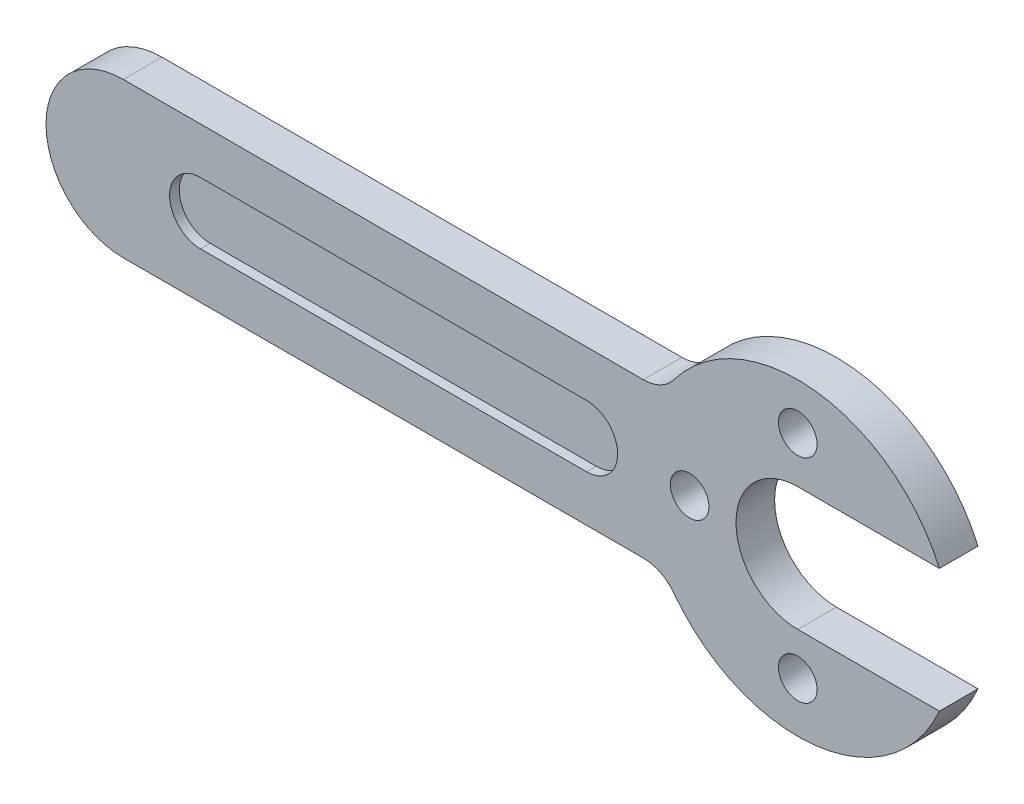
ISO-10303-21;
HEADER;
FILE_DESCRIPTION(('STEP AP214'),'2;1');
FILE_NAME('part.step','',(''),(''),'','','');
FILE_SCHEMA(('AUTOMOTIVE_DESIGN { 1 0 10303 214 1 1 1 1 }'));
ENDSEC;
DATA;
#1=APPLICATION_CONTEXT('core data for automotive mechanical design processes');
#2=APPLICATION_PROTOCOL_DEFINITION('international standard','automotive_design',2000,#1);
#3=PRODUCT_CONTEXT('',#1,'mechanical');
#4=PRODUCT('Part','Part','',(#3));
#5=PRODUCT_RELATED_PRODUCT_CATEGORY('part','',(#4));
#6=PRODUCT_DEFINITION_FORMATION('','',#4);
#7=PRODUCT_DEFINITION_CONTEXT('part definition',#1,'design');
#8=PRODUCT_DEFINITION('design','',#6,#7);
#9=PRODUCT_DEFINITION_SHAPE('','',#8);
#10=(LENGTH_UNIT() NAMED_UNIT(*) SI_UNIT(.MILLI.,.METRE.));
#11=(NAMED_UNIT(*) PLANE_ANGLE_UNIT() SI_UNIT($,.RADIAN.));
#12=(NAMED_UNIT(*) SI_UNIT($,.STERADIAN.) SOLID_ANGLE_UNIT());
#13=UNCERTAINTY_MEASURE_WITH_UNIT(LENGTH_MEASURE(1.E-05),#10,'distance_accuracy_value','');
#14=(GEOMETRIC_REPRESENTATION_CONTEXT(3) GLOBAL_UNCERTAINTY_ASSIGNED_CONTEXT((#13)) GLOBAL_UNIT_ASSIGNED_CONTEXT((#10,
#11,#12)) REPRESENTATION_CONTEXT('',''));
#15=CARTESIAN_POINT('',(0.,0.,0.));
#16=DIRECTION('',(0.,0.,1.));
#17=DIRECTION('',(1.,0.,0.));
#18=AXIS2_PLACEMENT_3D('',#15,#16,#17);
#19=CARTESIAN_POINT('',(-154.641016151378,0.,5.));
#20=DIRECTION('',(0.,0.,-1.));
#21=DIRECTION('',(-1.,0.,0.));
#22=AXIS2_PLACEMENT_3D('',#19,#20,#21);
#23=CYLINDRICAL_SURFACE('',#22,8.);
#24=DIRECTION('',(0.,0.,-1.));
#25=VECTOR('',#24,1.);
#26=CARTESIAN_POINT('',(-154.641016151378,7.99999999999999,5.));
#27=LINE('',#26,#25);
#28=CARTESIAN_POINT('',(-154.641016151378,7.99999999999999,-2.5));
#29=VERTEX_POINT('',#28);
#30=CARTESIAN_POINT('',(-154.641016151378,7.99999999999999,-5.));
#31=VERTEX_POINT('',#30);
#32=EDGE_CURVE('E184',#29,#31,#27,.T.);
#33=ORIENTED_EDGE('',*,*,#32,.F.);
#34=CARTESIAN_POINT('',(-154.641016151378,0.,-2.5));
#35=DIRECTION('',(0.,0.,1.));
#36=DIRECTION('',(1.,0.,0.));
#37=AXIS2_PLACEMENT_3D('',#34,#35,#36);
#38=CIRCLE('',#37,8.);
#39=CARTESIAN_POINT('',(-154.641016151378,-8.00000000000001,-2.5));
#40=VERTEX_POINT('',#39);
#41=EDGE_CURVE('E212',#29,#40,#38,.T.);
#42=ORIENTED_EDGE('',*,*,#41,.T.);
#43=DIRECTION('',(0.,0.,-1.));
#44=VECTOR('',#43,1.);
#45=CARTESIAN_POINT('',(-154.641016151378,-8.00000000000001,5.));
#46=LINE('',#45,#44);
#47=CARTESIAN_POINT('',(-154.641016151378,-8.00000000000001,-5.));
#48=VERTEX_POINT('',#47);
#49=EDGE_CURVE('E250',#40,#48,#46,.T.);
#50=ORIENTED_EDGE('',*,*,#49,.T.);
#51=CARTESIAN_POINT('',(-154.641016151378,0.,-5.));
#52=DIRECTION('',(0.,0.,1.));
#53=DIRECTION('',(1.,0.,0.));
#54=AXIS2_PLACEMENT_3D('',#51,#52,#53);
#55=CIRCLE('',#54,8.);
#56=EDGE_CURVE('E192',#31,#48,#55,.T.);
#57=ORIENTED_EDGE('',*,*,#56,.F.);
#58=EDGE_LOOP('',(#33,#42,#50,#57));
#59=FACE_BOUND('',#58,.T.);
#60=ADVANCED_FACE('F45',(#59),#23,.F.);
#61=CARTESIAN_POINT('',(-154.641016151378,-8.00000000000001,5.));
#62=DIRECTION('',(0.,1.,0.));
#63=DIRECTION('',(-1.,0.,0.));
#64=AXIS2_PLACEMENT_3D('',#61,#62,#63);
#65=PLANE('',#64);
#66=ORIENTED_EDGE('',*,*,#49,.F.);
#67=DIRECTION('',(1.,0.,0.));
#68=VECTOR('',#67,1.);
#69=CARTESIAN_POINT('',(0.,-7.99999999999995,-2.5));
#70=LINE('',#69,#68);
#71=CARTESIAN_POINT('',(-54.6410161513776,-7.99999999999997,-2.5));
#72=VERTEX_POINT('',#71);
#73=EDGE_CURVE('E201',#40,#72,#70,.T.);
#74=ORIENTED_EDGE('',*,*,#73,.T.);
#75=DIRECTION('',(0.,0.,-1.));
#76=VECTOR('',#75,1.);
#77=CARTESIAN_POINT('',(-54.6410161513776,-7.99999999999997,5.));
#78=LINE('',#77,#76);
#79=CARTESIAN_POINT('',(-54.6410161513776,-7.99999999999997,-5.));
#80=VERTEX_POINT('',#79);
#81=EDGE_CURVE('E246',#72,#80,#78,.T.);
#82=ORIENTED_EDGE('',*,*,#81,.T.);
#83=DIRECTION('',(1.,0.,0.));
#84=VECTOR('',#83,1.);
#85=CARTESIAN_POINT('',(-154.641016151378,-8.00000000000001,-5.));
#86=LINE('',#85,#84);
#87=EDGE_CURVE('E232',#48,#80,#86,.T.);
#88=ORIENTED_EDGE('',*,*,#87,.F.);
#89=EDGE_LOOP('',(#66,#74,#82,#88));
#90=FACE_BOUND('',#89,.T.);
#91=ADVANCED_FACE('F434',(#90),#65,.T.);
#92=CARTESIAN_POINT('',(-54.6410161513776,0.,5.));
#93=DIRECTION('',(0.,0.,-1.));
#94=DIRECTION('',(-1.,0.,0.));
#95=AXIS2_PLACEMENT_3D('',#92,#93,#94);
#96=CYLINDRICAL_SURFACE('',#95,8.);
#97=ORIENTED_EDGE('',*,*,#81,.F.);
#98=CARTESIAN_POINT('',(-54.6410161513776,0.,-2.5));
#99=DIRECTION('',(0.,0.,1.));
#100=DIRECTION('',(1.,0.,0.));
#101=AXIS2_PLACEMENT_3D('',#98,#99,#100);
#102=CIRCLE('',#101,8.);
#103=CARTESIAN_POINT('',(-54.6410161513776,8.00000000000003,-2.5));
#104=VERTEX_POINT('',#103);
#105=EDGE_CURVE('E205',#72,#104,#102,.T.);
#106=ORIENTED_EDGE('',*,*,#105,.T.);
#107=DIRECTION('',(0.,0.,-1.));
#108=VECTOR('',#107,1.);
#109=CARTESIAN_POINT('',(-54.6410161513776,8.00000000000003,5.));
#110=LINE('',#109,#108);
#111=CARTESIAN_POINT('',(-54.6410161513776,8.00000000000003,-5.));
#112=VERTEX_POINT('',#111);
#113=EDGE_CURVE('E183',#104,#112,#110,.T.);
#114=ORIENTED_EDGE('',*,*,#113,.T.);
#115=CARTESIAN_POINT('',(-54.6410161513776,0.,-5.));
#116=DIRECTION('',(0.,0.,1.));
#117=DIRECTION('',(1.,0.,0.));
#118=AXIS2_PLACEMENT_3D('',#115,#116,#117);
#119=CIRCLE('',#118,8.);
#120=EDGE_CURVE('E236',#80,#112,#119,.T.);
#121=ORIENTED_EDGE('',*,*,#120,.F.);
#122=EDGE_LOOP('',(#97,#106,#114,#121));
#123=FACE_BOUND('',#122,.T.);
#124=ADVANCED_FACE('F440',(#123),#96,.F.);
#125=CARTESIAN_POINT('',(-154.641016151378,7.99999999999999,5.));
#126=DIRECTION('',(0.,-1.,0.));
#127=DIRECTION('',(1.,0.,0.));
#128=AXIS2_PLACEMENT_3D('',#125,#126,#127);
#129=PLANE('',#128);
#130=ORIENTED_EDGE('',*,*,#113,.F.);
#131=DIRECTION('',(1.,0.,0.));
#132=VECTOR('',#131,1.);
#133=CARTESIAN_POINT('',(0.,8.00000000000006,-2.5));
#134=LINE('',#133,#132);
#135=EDGE_CURVE('E209',#29,#104,#134,.T.);
#136=ORIENTED_EDGE('',*,*,#135,.F.);
#137=ORIENTED_EDGE('',*,*,#32,.T.);
#138=DIRECTION('',(-1.,0.,0.));
#139=VECTOR('',#138,1.);
#140=CARTESIAN_POINT('',(-154.641016151378,7.99999999999999,-5.));
#141=LINE('',#140,#139);
#142=EDGE_CURVE('E220',#112,#31,#141,.T.);
#143=ORIENTED_EDGE('',*,*,#142,.F.);
#144=EDGE_LOOP('',(#130,#136,#137,#143));
#145=FACE_BOUND('',#144,.T.);
#146=ADVANCED_FACE('F468',(#145),#129,.T.);
#147=CARTESIAN_POINT('',(0.,0.,5.));
#148=DIRECTION('',(0.,0.,1.));
#149=DIRECTION('',(1.,0.,0.));
#150=AXIS2_PLACEMENT_3D('',#147,#148,#149);
#151=PLANE('',#150);
#152=CARTESIAN_POINT('',(0.,-27.,5.));
#153=DIRECTION('',(0.,0.,1.));
#154=DIRECTION('',(1.,0.,0.));
#155=AXIS2_PLACEMENT_3D('',#152,#153,#154);
#156=CIRCLE('',#155,5.);
#157=CARTESIAN_POINT('',(5.00000000000001,-27.,5.));
#158=VERTEX_POINT('',#157);
#159=EDGE_CURVE('E262',#158,#158,#156,.T.);
#160=ORIENTED_EDGE('',*,*,#159,.F.);
#161=EDGE_LOOP('',(#160));
#162=FACE_BOUND('',#161,.T.);
#163=CARTESIAN_POINT('',(0.,0.,5.));
#164=DIRECTION('',(0.,0.,-1.));
#165=DIRECTION('',(1.,0.,0.));
#166=AXIS2_PLACEMENT_3D('',#163,#164,#165);
#167=CIRCLE('',#166,16.);
#168=CARTESIAN_POINT('',(0.,-16.,5.));
#169=VERTEX_POINT('',#168);
#170=CARTESIAN_POINT('',(0.,16.,5.));
#171=VERTEX_POINT('',#170);
#172=EDGE_CURVE('E278',#169,#171,#167,.T.);
#173=ORIENTED_EDGE('',*,*,#172,.T.);
#174=DIRECTION('',(1.,0.,0.));
#175=VECTOR('',#174,1.);
#176=CARTESIAN_POINT('',(0.,16.,5.));
#177=LINE('',#176,#175);
#178=CARTESIAN_POINT('',(36.6606055596467,16.,5.));
#179=VERTEX_POINT('',#178);
#180=EDGE_CURVE('E282',#171,#179,#177,.T.);
#181=ORIENTED_EDGE('',*,*,#180,.T.);
#182=CARTESIAN_POINT('',(0.,0.,5.));
#183=DIRECTION('',(0.,0.,1.));
#184=DIRECTION('',(1.,0.,0.));
#185=AXIS2_PLACEMENT_3D('',#182,#183,#184);
#186=CIRCLE('',#185,40.);
#187=CARTESIAN_POINT('',(-32.,24.,5.));
#188=VERTEX_POINT('',#187);
#189=EDGE_CURVE('E286',#179,#188,#186,.T.);
#190=ORIENTED_EDGE('',*,*,#189,.T.);
#191=CARTESIAN_POINT('',(-40.,30.,5.));
#192=DIRECTION('',(0.,0.,-1.));
#193=DIRECTION('',(1.,0.,0.));
#194=AXIS2_PLACEMENT_3D('',#191,#192,#193);
#195=CIRCLE('',#194,10.);
#196=CARTESIAN_POINT('',(-40.,20.,5.));
#197=VERTEX_POINT('',#196);
#198=EDGE_CURVE('E289',#188,#197,#195,.T.);
#199=ORIENTED_EDGE('',*,*,#198,.T.);
#200=DIRECTION('',(-1.,0.,0.));
#201=VECTOR('',#200,1.);
#202=CARTESIAN_POINT('',(-40.,20.,5.));
#203=LINE('',#202,#201);
#204=CARTESIAN_POINT('',(-174.641016151378,20.,5.));
#205=VERTEX_POINT('',#204);
#206=EDGE_CURVE('E292',#197,#205,#203,.T.);
#207=ORIENTED_EDGE('',*,*,#206,.T.);
#208=CARTESIAN_POINT('',(-174.641016151378,0.,5.));
#209=DIRECTION('',(0.,0.,1.));
#210=DIRECTION('',(1.,0.,0.));
#211=AXIS2_PLACEMENT_3D('',#208,#209,#210);
#212=CIRCLE('',#211,20.);
#213=CARTESIAN_POINT('',(-174.641016151378,-20.0000000000001,5.));
#214=VERTEX_POINT('',#213);
#215=EDGE_CURVE('E295',#205,#214,#212,.T.);
#216=ORIENTED_EDGE('',*,*,#215,.T.);
#217=DIRECTION('',(1.,0.,0.));
#218=VECTOR('',#217,1.);
#219=CARTESIAN_POINT('',(-174.641016151378,-20.,5.));
#220=LINE('',#219,#218);
#221=CARTESIAN_POINT('',(-40.,-20.,5.));
#222=VERTEX_POINT('',#221);
#223=EDGE_CURVE('E298',#214,#222,#220,.T.);
#224=ORIENTED_EDGE('',*,*,#223,.T.);
#225=CARTESIAN_POINT('',(-40.,-30.,5.));
#226=DIRECTION('',(0.,0.,-1.));
#227=DIRECTION('',(-1.,0.,0.));
#228=AXIS2_PLACEMENT_3D('',#225,#226,#227);
#229=CIRCLE('',#228,10.);
#230=CARTESIAN_POINT('',(-32.,-24.,5.));
#231=VERTEX_POINT('',#230);
#232=EDGE_CURVE('E301',#222,#231,#229,.T.);
#233=ORIENTED_EDGE('',*,*,#232,.T.);
#234=CARTESIAN_POINT('',(0.,0.,5.));
#235=DIRECTION('',(0.,0.,1.));
#236=DIRECTION('',(1.,0.,0.));
#237=AXIS2_PLACEMENT_3D('',#234,#235,#236);
#238=CIRCLE('',#237,40.);
#239=CARTESIAN_POINT('',(36.6606055596467,-16.,5.));
#240=VERTEX_POINT('',#239);
#241=EDGE_CURVE('E304',#231,#240,#238,.T.);
#242=ORIENTED_EDGE('',*,*,#241,.T.);
#243=DIRECTION('',(-1.,0.,0.));
#244=VECTOR('',#243,1.);
#245=CARTESIAN_POINT('',(0.,-16.,5.));
#246=LINE('',#245,#244);
#247=EDGE_CURVE('E307',#240,#169,#246,.T.);
#248=ORIENTED_EDGE('',*,*,#247,.T.);
#249=EDGE_LOOP('',(#173,#181,#190,#199,#207,#216,#224,#233,#242,#248));
#250=FACE_BOUND('',#249,.T.);
#251=CARTESIAN_POINT('',(0.,28.,5.));
#252=DIRECTION('',(0.,0.,1.));
#253=DIRECTION('',(1.,0.,0.));
#254=AXIS2_PLACEMENT_3D('',#251,#252,#253);
#255=CIRCLE('',#254,5.);
#256=CARTESIAN_POINT('',(5.00000000000001,28.,5.));
#257=VERTEX_POINT('',#256);
#258=EDGE_CURVE('E270',#257,#257,#255,.T.);
#259=ORIENTED_EDGE('',*,*,#258,.F.);
#260=EDGE_LOOP('',(#259));
#261=FACE_BOUND('',#260,.T.);
#262=CARTESIAN_POINT('',(-28.,0.,5.));
#263=DIRECTION('',(0.,0.,1.));
#264=DIRECTION('',(1.,0.,0.));
#265=AXIS2_PLACEMENT_3D('',#262,#263,#264);
#266=CIRCLE('',#265,5.);
#267=CARTESIAN_POINT('',(-23.,0.,5.));
#268=VERTEX_POINT('',#267);
#269=EDGE_CURVE('E254',#268,#268,#266,.T.);
#270=ORIENTED_EDGE('',*,*,#269,.F.);
#271=EDGE_LOOP('',(#270));
#272=FACE_BOUND('',#271,.T.);
#273=DIRECTION('',(1.,0.,0.));
#274=VECTOR('',#273,1.);
#275=CARTESIAN_POINT('',(-154.641016151378,-8.00000000000001,5.));
#276=LINE('',#275,#274);
#277=CARTESIAN_POINT('',(-154.641016151378,-8.00000000000001,5.));
#278=VERTEX_POINT('',#277);
#279=CARTESIAN_POINT('',(-54.6410161513776,-7.99999999999997,5.));
#280=VERTEX_POINT('',#279);
#281=EDGE_CURVE('E219',#278,#280,#276,.T.);
#282=ORIENTED_EDGE('',*,*,#281,.F.);
#283=CARTESIAN_POINT('',(-154.641016151378,0.,5.));
#284=DIRECTION('',(0.,0.,1.));
#285=DIRECTION('',(1.,0.,0.));
#286=AXIS2_PLACEMENT_3D('',#283,#284,#285);
#287=CIRCLE('',#286,8.);
#288=CARTESIAN_POINT('',(-154.641016151378,7.99999999999999,5.));
#289=VERTEX_POINT('',#288);
#290=EDGE_CURVE('E216',#289,#278,#287,.T.);
#291=ORIENTED_EDGE('',*,*,#290,.F.);
#292=DIRECTION('',(-1.,0.,0.));
#293=VECTOR('',#292,1.);
#294=CARTESIAN_POINT('',(-154.641016151378,7.99999999999999,5.));
#295=LINE('',#294,#293);
#296=CARTESIAN_POINT('',(-54.6410161513776,8.00000000000003,5.));
#297=VERTEX_POINT('',#296);
#298=EDGE_CURVE('E179',#297,#289,#295,.T.);
#299=ORIENTED_EDGE('',*,*,#298,.F.);
#300=CARTESIAN_POINT('',(-54.6410161513776,0.,5.));
#301=DIRECTION('',(0.,0.,1.));
#302=DIRECTION('',(1.,0.,0.));
#303=AXIS2_PLACEMENT_3D('',#300,#301,#302);
#304=CIRCLE('',#303,8.);
#305=EDGE_CURVE('E223',#280,#297,#304,.T.);
#306=ORIENTED_EDGE('',*,*,#305,.F.);
#307=EDGE_LOOP('',(#282,#291,#299,#306));
#308=FACE_BOUND('',#307,.T.);
#309=ADVANCED_FACE('F396',(#162,#250,#261,#272,#308),#151,.T.);
#310=CARTESIAN_POINT('',(0.,0.,-5.));
#311=DIRECTION('',(0.,0.,1.));
#312=DIRECTION('',(1.,0.,0.));
#313=AXIS2_PLACEMENT_3D('',#310,#311,#312);
#314=PLANE('',#313);
#315=CARTESIAN_POINT('',(-28.,0.,-5.));
#316=DIRECTION('',(0.,0.,1.));
#317=DIRECTION('',(1.,0.,0.));
#318=AXIS2_PLACEMENT_3D('',#315,#316,#317);
#319=CIRCLE('',#318,5.);
#320=CARTESIAN_POINT('',(-23.,0.,-5.));
#321=VERTEX_POINT('',#320);
#322=EDGE_CURVE('E253',#321,#321,#319,.T.);
#323=ORIENTED_EDGE('',*,*,#322,.T.);
#324=EDGE_LOOP('',(#323));
#325=FACE_BOUND('',#324,.T.);
#326=CARTESIAN_POINT('',(0.,-27.,-5.));
#327=DIRECTION('',(0.,0.,1.));
#328=DIRECTION('',(1.,0.,0.));
#329=AXIS2_PLACEMENT_3D('',#326,#327,#328);
#330=CIRCLE('',#329,5.);
#331=CARTESIAN_POINT('',(5.00000000000001,-27.,-5.));
#332=VERTEX_POINT('',#331);
#333=EDGE_CURVE('E258',#332,#332,#330,.T.);
#334=ORIENTED_EDGE('',*,*,#333,.T.);
#335=EDGE_LOOP('',(#334));
#336=FACE_BOUND('',#335,.T.);
#337=CARTESIAN_POINT('',(0.,28.,-5.));
#338=DIRECTION('',(0.,0.,1.));
#339=DIRECTION('',(1.,0.,0.));
#340=AXIS2_PLACEMENT_3D('',#337,#338,#339);
#341=CIRCLE('',#340,5.);
#342=CARTESIAN_POINT('',(5.00000000000001,28.,-5.));
#343=VERTEX_POINT('',#342);
#344=EDGE_CURVE('E266',#343,#343,#341,.T.);
#345=ORIENTED_EDGE('',*,*,#344,.T.);
#346=EDGE_LOOP('',(#345));
#347=FACE_BOUND('',#346,.T.);
#348=CARTESIAN_POINT('',(0.,0.,-5.));
#349=DIRECTION('',(0.,0.,-1.));
#350=DIRECTION('',(1.,0.,0.));
#351=AXIS2_PLACEMENT_3D('',#348,#349,#350);
#352=CIRCLE('',#351,16.);
#353=CARTESIAN_POINT('',(0.,-16.,-5.));
#354=VERTEX_POINT('',#353);
#355=CARTESIAN_POINT('',(0.,16.,-5.));
#356=VERTEX_POINT('',#355);
#357=EDGE_CURVE('E274',#354,#356,#352,.T.);
#358=ORIENTED_EDGE('',*,*,#357,.F.);
#359=DIRECTION('',(-1.,0.,0.));
#360=VECTOR('',#359,1.);
#361=CARTESIAN_POINT('',(0.,-16.,-5.));
#362=LINE('',#361,#360);
#363=CARTESIAN_POINT('',(36.6606055596467,-16.,-5.));
#364=VERTEX_POINT('',#363);
#365=EDGE_CURVE('E283',#364,#354,#362,.T.);
#366=ORIENTED_EDGE('',*,*,#365,.F.);
#367=CARTESIAN_POINT('',(0.,0.,-5.));
#368=DIRECTION('',(0.,0.,1.));
#369=DIRECTION('',(1.,0.,0.));
#370=AXIS2_PLACEMENT_3D('',#367,#368,#369);
#371=CIRCLE('',#370,40.);
#372=CARTESIAN_POINT('',(-32.,-24.,-5.));
#373=VERTEX_POINT('',#372);
#374=EDGE_CURVE('E335',#373,#364,#371,.T.);
#375=ORIENTED_EDGE('',*,*,#374,.F.);
#376=CARTESIAN_POINT('',(-40.,-30.,-5.));
#377=DIRECTION('',(0.,0.,-1.));
#378=DIRECTION('',(-1.,0.,0.));
#379=AXIS2_PLACEMENT_3D('',#376,#377,#378);
#380=CIRCLE('',#379,10.);
#381=CARTESIAN_POINT('',(-40.,-20.,-5.));
#382=VERTEX_POINT('',#381);
#383=EDGE_CURVE('E332',#382,#373,#380,.T.);
#384=ORIENTED_EDGE('',*,*,#383,.F.);
#385=DIRECTION('',(1.,0.,0.));
#386=VECTOR('',#385,1.);
#387=CARTESIAN_POINT('',(-174.641016151378,-20.,-5.));
#388=LINE('',#387,#386);
#389=CARTESIAN_POINT('',(-174.641016151378,-20.0000000000001,-5.));
#390=VERTEX_POINT('',#389);
#391=EDGE_CURVE('E329',#390,#382,#388,.T.);
#392=ORIENTED_EDGE('',*,*,#391,.F.);
#393=CARTESIAN_POINT('',(-174.641016151378,0.,-5.));
#394=DIRECTION('',(0.,0.,1.));
#395=DIRECTION('',(1.,0.,0.));
#396=AXIS2_PLACEMENT_3D('',#393,#394,#395);
#397=CIRCLE('',#396,20.);
#398=CARTESIAN_POINT('',(-174.641016151378,20.,-5.));
#399=VERTEX_POINT('',#398);
#400=EDGE_CURVE('E326',#399,#390,#397,.T.);
#401=ORIENTED_EDGE('',*,*,#400,.F.);
#402=DIRECTION('',(-1.,0.,0.));
#403=VECTOR('',#402,1.);
#404=CARTESIAN_POINT('',(-40.,20.,-5.));
#405=LINE('',#404,#403);
#406=CARTESIAN_POINT('',(-40.,20.,-5.));
#407=VERTEX_POINT('',#406);
#408=EDGE_CURVE('E323',#407,#399,#405,.T.);
#409=ORIENTED_EDGE('',*,*,#408,.F.);
#410=CARTESIAN_POINT('',(-40.,30.,-5.));
#411=DIRECTION('',(0.,0.,-1.));
#412=DIRECTION('',(1.,0.,0.));
#413=AXIS2_PLACEMENT_3D('',#410,#411,#412);
#414=CIRCLE('',#413,10.);
#415=CARTESIAN_POINT('',(-32.,24.,-5.));
#416=VERTEX_POINT('',#415);
#417=EDGE_CURVE('E320',#416,#407,#414,.T.);
#418=ORIENTED_EDGE('',*,*,#417,.F.);
#419=CARTESIAN_POINT('',(0.,0.,-5.));
#420=DIRECTION('',(0.,0.,1.));
#421=DIRECTION('',(1.,0.,0.));
#422=AXIS2_PLACEMENT_3D('',#419,#420,#421);
#423=CIRCLE('',#422,40.);
#424=CARTESIAN_POINT('',(36.6606055596467,16.,-5.));
#425=VERTEX_POINT('',#424);
#426=EDGE_CURVE('E317',#425,#416,#423,.T.);
#427=ORIENTED_EDGE('',*,*,#426,.F.);
#428=DIRECTION('',(1.,0.,0.));
#429=VECTOR('',#428,1.);
#430=CARTESIAN_POINT('',(0.,16.,-5.));
#431=LINE('',#430,#429);
#432=EDGE_CURVE('E314',#356,#425,#431,.T.);
#433=ORIENTED_EDGE('',*,*,#432,.F.);
#434=EDGE_LOOP('',(#358,#366,#375,#384,#392,#401,#409,#418,#427,#433));
#435=FACE_BOUND('',#434,.T.);
#436=ORIENTED_EDGE('',*,*,#56,.T.);
#437=ORIENTED_EDGE('',*,*,#87,.T.);
#438=ORIENTED_EDGE('',*,*,#120,.T.);
#439=ORIENTED_EDGE('',*,*,#142,.T.);
#440=EDGE_LOOP('',(#436,#437,#438,#439));
#441=FACE_BOUND('',#440,.T.);
#442=ADVANCED_FACE('F382',(#325,#336,#347,#435,#441),#314,.F.);
#443=CARTESIAN_POINT('',(0.,0.,5.));
#444=DIRECTION('',(0.,0.,-1.));
#445=DIRECTION('',(-1.,0.,0.));
#446=AXIS2_PLACEMENT_3D('',#443,#444,#445);
#447=CYLINDRICAL_SURFACE('',#446,16.);
#448=ORIENTED_EDGE('',*,*,#357,.T.);
#449=DIRECTION('',(0.,0.,-1.));
#450=VECTOR('',#449,1.);
#451=CARTESIAN_POINT('',(0.,16.,5.));
#452=LINE('',#451,#450);
#453=EDGE_CURVE('E11',#171,#356,#452,.T.);
#454=ORIENTED_EDGE('',*,*,#453,.F.);
#455=ORIENTED_EDGE('',*,*,#172,.F.);
#456=DIRECTION('',(0.,0.,-1.));
#457=VECTOR('',#456,1.);
#458=CARTESIAN_POINT('',(0.,-16.,5.));
#459=LINE('',#458,#457);
#460=EDGE_CURVE('E310',#169,#354,#459,.T.);
#461=ORIENTED_EDGE('',*,*,#460,.T.);
#462=EDGE_LOOP('',(#448,#454,#455,#461));
#463=FACE_BOUND('',#462,.T.);
#464=ADVANCED_FACE('F47',(#463),#447,.F.);
#465=CARTESIAN_POINT('',(0.,16.,5.));
#466=DIRECTION('',(0.,1.,0.));
#467=DIRECTION('',(0.,0.,1.));
#468=AXIS2_PLACEMENT_3D('',#465,#466,#467);
#469=PLANE('',#468);
#470=ORIENTED_EDGE('',*,*,#432,.T.);
#471=DIRECTION('',(0.,0.,-1.));
#472=VECTOR('',#471,1.);
#473=CARTESIAN_POINT('',(36.6606055596467,16.,5.));
#474=LINE('',#473,#472);
#475=EDGE_CURVE('E54',#179,#425,#474,.T.);
#476=ORIENTED_EDGE('',*,*,#475,.F.);
#477=ORIENTED_EDGE('',*,*,#180,.F.);
#478=ORIENTED_EDGE('',*,*,#453,.T.);
#479=EDGE_LOOP('',(#470,#476,#477,#478));
#480=FACE_BOUND('',#479,.T.);
#481=ADVANCED_FACE('F401',(#480),#469,.F.);
#482=CARTESIAN_POINT('',(0.,0.,5.));
#483=DIRECTION('',(0.,0.,-1.));
#484=DIRECTION('',(-1.,0.,0.));
#485=AXIS2_PLACEMENT_3D('',#482,#483,#484);
#486=CYLINDRICAL_SURFACE('',#485,40.);
#487=ORIENTED_EDGE('',*,*,#426,.T.);
#488=DIRECTION('',(0.,0.,-1.));
#489=VECTOR('',#488,1.);
#490=CARTESIAN_POINT('',(-32.,24.,5.));
#491=LINE('',#490,#489);
#492=EDGE_CURVE('E367',#188,#416,#491,.T.);
#493=ORIENTED_EDGE('',*,*,#492,.F.);
#494=ORIENTED_EDGE('',*,*,#189,.F.);
#495=ORIENTED_EDGE('',*,*,#475,.T.);
#496=EDGE_LOOP('',(#487,#493,#494,#495));
#497=FACE_BOUND('',#496,.T.);
#498=ADVANCED_FACE('F376',(#497),#486,.T.);
#499=CARTESIAN_POINT('',(-40.,30.,5.));
#500=DIRECTION('',(0.,0.,-1.));
#501=DIRECTION('',(-1.,0.,0.));
#502=AXIS2_PLACEMENT_3D('',#499,#500,#501);
#503=CYLINDRICAL_SURFACE('',#502,10.);
#504=ORIENTED_EDGE('',*,*,#417,.T.);
#505=DIRECTION('',(0.,0.,-1.));
#506=VECTOR('',#505,1.);
#507=CARTESIAN_POINT('',(-40.,20.,5.));
#508=LINE('',#507,#506);
#509=EDGE_CURVE('E363',#197,#407,#508,.T.);
#510=ORIENTED_EDGE('',*,*,#509,.F.);
#511=ORIENTED_EDGE('',*,*,#198,.F.);
#512=ORIENTED_EDGE('',*,*,#492,.T.);
#513=EDGE_LOOP('',(#504,#510,#511,#512));
#514=FACE_BOUND('',#513,.T.);
#515=ADVANCED_FACE('F388',(#514),#503,.F.);
#516=CARTESIAN_POINT('',(-40.,20.,5.));
#517=DIRECTION('',(0.,-1.,0.));
#518=DIRECTION('',(1.,0.,0.));
#519=AXIS2_PLACEMENT_3D('',#516,#517,#518);
#520=PLANE('',#519);
#521=ORIENTED_EDGE('',*,*,#408,.T.);
#522=DIRECTION('',(0.,0.,-1.));
#523=VECTOR('',#522,1.);
#524=CARTESIAN_POINT('',(-174.641016151378,20.,5.));
#525=LINE('',#524,#523);
#526=EDGE_CURVE('E359',#205,#399,#525,.T.);
#527=ORIENTED_EDGE('',*,*,#526,.F.);
#528=ORIENTED_EDGE('',*,*,#206,.F.);
#529=ORIENTED_EDGE('',*,*,#509,.T.);
#530=EDGE_LOOP('',(#521,#527,#528,#529));
#531=FACE_BOUND('',#530,.T.);
#532=ADVANCED_FACE('F392',(#531),#520,.F.);
#533=CARTESIAN_POINT('',(-174.641016151378,0.,5.));
#534=DIRECTION('',(0.,0.,-1.));
#535=DIRECTION('',(-1.,0.,0.));
#536=AXIS2_PLACEMENT_3D('',#533,#534,#535);
#537=CYLINDRICAL_SURFACE('',#536,20.);
#538=ORIENTED_EDGE('',*,*,#400,.T.);
#539=DIRECTION('',(0.,0.,-1.));
#540=VECTOR('',#539,1.);
#541=CARTESIAN_POINT('',(-174.641016151378,-20.0000000000001,5.));
#542=LINE('',#541,#540);
#543=EDGE_CURVE('E355',#214,#390,#542,.T.);
#544=ORIENTED_EDGE('',*,*,#543,.F.);
#545=ORIENTED_EDGE('',*,*,#215,.F.);
#546=ORIENTED_EDGE('',*,*,#526,.T.);
#547=EDGE_LOOP('',(#538,#544,#545,#546));
#548=FACE_BOUND('',#547,.T.);
#549=ADVANCED_FACE('F424',(#548),#537,.T.);
#550=CARTESIAN_POINT('',(-174.641016151378,-20.,5.));
#551=DIRECTION('',(0.,1.,0.));
#552=DIRECTION('',(-1.,0.,0.));
#553=AXIS2_PLACEMENT_3D('',#550,#551,#552);
#554=PLANE('',#553);
#555=ORIENTED_EDGE('',*,*,#391,.T.);
#556=DIRECTION('',(0.,0.,-1.));
#557=VECTOR('',#556,1.);
#558=CARTESIAN_POINT('',(-40.,-20.,5.));
#559=LINE('',#558,#557);
#560=EDGE_CURVE('E351',#222,#382,#559,.T.);
#561=ORIENTED_EDGE('',*,*,#560,.F.);
#562=ORIENTED_EDGE('',*,*,#223,.F.);
#563=ORIENTED_EDGE('',*,*,#543,.T.);
#564=EDGE_LOOP('',(#555,#561,#562,#563));
#565=FACE_BOUND('',#564,.T.);
#566=ADVANCED_FACE('F421',(#565),#554,.F.);
#567=CARTESIAN_POINT('',(-40.,-30.,5.));
#568=DIRECTION('',(0.,0.,-1.));
#569=DIRECTION('',(-1.,0.,0.));
#570=AXIS2_PLACEMENT_3D('',#567,#568,#569);
#571=CYLINDRICAL_SURFACE('',#570,10.);
#572=ORIENTED_EDGE('',*,*,#383,.T.);
#573=DIRECTION('',(0.,0.,-1.));
#574=VECTOR('',#573,1.);
#575=CARTESIAN_POINT('',(-32.,-24.,5.));
#576=LINE('',#575,#574);
#577=EDGE_CURVE('E347',#231,#373,#576,.T.);
#578=ORIENTED_EDGE('',*,*,#577,.F.);
#579=ORIENTED_EDGE('',*,*,#232,.F.);
#580=ORIENTED_EDGE('',*,*,#560,.T.);
#581=EDGE_LOOP('',(#572,#578,#579,#580));
#582=FACE_BOUND('',#581,.T.);
#583=ADVANCED_FACE('F417',(#582),#571,.F.);
#584=CARTESIAN_POINT('',(0.,0.,5.));
#585=DIRECTION('',(0.,0.,-1.));
#586=DIRECTION('',(-1.,0.,0.));
#587=AXIS2_PLACEMENT_3D('',#584,#585,#586);
#588=CYLINDRICAL_SURFACE('',#587,40.);
#589=ORIENTED_EDGE('',*,*,#374,.T.);
#590=DIRECTION('',(0.,0.,-1.));
#591=VECTOR('',#590,1.);
#592=CARTESIAN_POINT('',(36.6606055596467,-16.,5.));
#593=LINE('',#592,#591);
#594=EDGE_CURVE('E343',#240,#364,#593,.T.);
#595=ORIENTED_EDGE('',*,*,#594,.F.);
#596=ORIENTED_EDGE('',*,*,#241,.F.);
#597=ORIENTED_EDGE('',*,*,#577,.T.);
#598=EDGE_LOOP('',(#589,#595,#596,#597));
#599=FACE_BOUND('',#598,.T.);
#600=ADVANCED_FACE('F413',(#599),#588,.T.);
#601=CARTESIAN_POINT('',(0.,-16.,5.));
#602=DIRECTION('',(0.,-1.,0.));
#603=DIRECTION('',(0.,0.,-1.));
#604=AXIS2_PLACEMENT_3D('',#601,#602,#603);
#605=PLANE('',#604);
#606=ORIENTED_EDGE('',*,*,#365,.T.);
#607=ORIENTED_EDGE('',*,*,#460,.F.);
#608=ORIENTED_EDGE('',*,*,#247,.F.);
#609=ORIENTED_EDGE('',*,*,#594,.T.);
#610=EDGE_LOOP('',(#606,#607,#608,#609));
#611=FACE_BOUND('',#610,.T.);
#612=ADVANCED_FACE('F408',(#611),#605,.F.);
#613=CARTESIAN_POINT('',(0.,28.,5.));
#614=DIRECTION('',(0.,0.,-1.));
#615=DIRECTION('',(-1.,0.,0.));
#616=AXIS2_PLACEMENT_3D('',#613,#614,#615);
#617=CYLINDRICAL_SURFACE('',#616,5.);
#618=ORIENTED_EDGE('',*,*,#258,.T.);
#619=EDGE_LOOP('',(#618));
#620=FACE_BOUND('',#619,.T.);
#621=ORIENTED_EDGE('',*,*,#344,.F.);
#622=EDGE_LOOP('',(#621));
#623=FACE_BOUND('',#622,.T.);
#624=ADVANCED_FACE('F458',(#620,#623),#617,.F.);
#625=CARTESIAN_POINT('',(0.,-27.,5.));
#626=DIRECTION('',(0.,0.,-1.));
#627=DIRECTION('',(-1.,0.,0.));
#628=AXIS2_PLACEMENT_3D('',#625,#626,#627);
#629=CYLINDRICAL_SURFACE('',#628,5.);
#630=ORIENTED_EDGE('',*,*,#159,.T.);
#631=EDGE_LOOP('',(#630));
#632=FACE_BOUND('',#631,.T.);
#633=ORIENTED_EDGE('',*,*,#333,.F.);
#634=EDGE_LOOP('',(#633));
#635=FACE_BOUND('',#634,.T.);
#636=ADVANCED_FACE('F453',(#632,#635),#629,.F.);
#637=CARTESIAN_POINT('',(-28.,0.,5.));
#638=DIRECTION('',(0.,0.,-1.));
#639=DIRECTION('',(-1.,0.,0.));
#640=AXIS2_PLACEMENT_3D('',#637,#638,#639);
#641=CYLINDRICAL_SURFACE('',#640,5.);
#642=ORIENTED_EDGE('',*,*,#269,.T.);
#643=EDGE_LOOP('',(#642));
#644=FACE_BOUND('',#643,.T.);
#645=ORIENTED_EDGE('',*,*,#322,.F.);
#646=EDGE_LOOP('',(#645));
#647=FACE_BOUND('',#646,.T.);
#648=ADVANCED_FACE('F447',(#644,#647),#641,.F.);
#649=CARTESIAN_POINT('',(-154.641016151378,0.,2.5));
#650=DIRECTION('',(0.,0.,1.));
#651=DIRECTION('',(1.,0.,0.));
#652=AXIS2_PLACEMENT_3D('',#649,#650,#651);
#653=CIRCLE('',#652,8.);
#654=CARTESIAN_POINT('',(-154.641016151378,7.99999999999999,2.5));
#655=VERTEX_POINT('',#654);
#656=CARTESIAN_POINT('',(-154.641016151378,-8.00000000000001,2.5));
#657=VERTEX_POINT('',#656);
#658=EDGE_CURVE('E187',#655,#657,#653,.T.);
#659=ORIENTED_EDGE('',*,*,#658,.F.);
#660=EDGE_CURVE('E173',#289,#655,#27,.T.);
#661=ORIENTED_EDGE('',*,*,#660,.F.);
#662=ORIENTED_EDGE('',*,*,#290,.T.);
#663=EDGE_CURVE('E189',#278,#657,#46,.T.);
#664=ORIENTED_EDGE('',*,*,#663,.T.);
#665=EDGE_LOOP('',(#659,#661,#662,#664));
#666=FACE_BOUND('',#665,.T.);
#667=ADVANCED_FACE('F188',(#666),#23,.F.);
#668=DIRECTION('',(1.,0.,0.));
#669=VECTOR('',#668,1.);
#670=CARTESIAN_POINT('',(0.,-7.99999999999995,2.5));
#671=LINE('',#670,#669);
#672=CARTESIAN_POINT('',(-54.6410161513776,-7.99999999999997,2.5));
#673=VERTEX_POINT('',#672);
#674=EDGE_CURVE('E61',#657,#673,#671,.T.);
#675=ORIENTED_EDGE('',*,*,#674,.F.);
#676=ORIENTED_EDGE('',*,*,#663,.F.);
#677=ORIENTED_EDGE('',*,*,#281,.T.);
#678=EDGE_CURVE('E247',#280,#673,#78,.T.);
#679=ORIENTED_EDGE('',*,*,#678,.T.);
#680=EDGE_LOOP('',(#675,#676,#677,#679));
#681=FACE_BOUND('',#680,.T.);
#682=ADVANCED_FACE('F443',(#681),#65,.T.);
#683=CARTESIAN_POINT('',(-54.6410161513776,0.,2.5));
#684=DIRECTION('',(0.,0.,1.));
#685=DIRECTION('',(1.,0.,0.));
#686=AXIS2_PLACEMENT_3D('',#683,#684,#685);
#687=CIRCLE('',#686,8.);
#688=CARTESIAN_POINT('',(-54.6410161513776,8.00000000000003,2.5));
#689=VERTEX_POINT('',#688);
#690=EDGE_CURVE('E69',#673,#689,#687,.T.);
#691=ORIENTED_EDGE('',*,*,#690,.F.);
#692=ORIENTED_EDGE('',*,*,#678,.F.);
#693=ORIENTED_EDGE('',*,*,#305,.T.);
#694=EDGE_CURVE('E243',#297,#689,#110,.T.);
#695=ORIENTED_EDGE('',*,*,#694,.T.);
#696=EDGE_LOOP('',(#691,#692,#693,#695));
#697=FACE_BOUND('',#696,.T.);
#698=ADVANCED_FACE('F452',(#697),#96,.F.);
#699=DIRECTION('',(1.,0.,0.));
#700=VECTOR('',#699,1.);
#701=CARTESIAN_POINT('',(0.,8.00000000000006,2.5));
#702=LINE('',#701,#700);
#703=EDGE_CURVE('E177',#655,#689,#702,.T.);
#704=ORIENTED_EDGE('',*,*,#703,.T.);
#705=ORIENTED_EDGE('',*,*,#694,.F.);
#706=ORIENTED_EDGE('',*,*,#298,.T.);
#707=ORIENTED_EDGE('',*,*,#660,.T.);
#708=EDGE_LOOP('',(#704,#705,#706,#707));
#709=FACE_BOUND('',#708,.T.);
#710=ADVANCED_FACE('F175',(#709),#129,.T.);
#711=CARTESIAN_POINT('',(0.,0.,-2.5));
#712=DIRECTION('',(0.,0.,1.));
#713=DIRECTION('',(1.,0.,0.));
#714=AXIS2_PLACEMENT_3D('',#711,#712,#713);
#715=PLANE('',#714);
#716=ORIENTED_EDGE('',*,*,#73,.F.);
#717=ORIENTED_EDGE('',*,*,#41,.F.);
#718=ORIENTED_EDGE('',*,*,#135,.T.);
#719=ORIENTED_EDGE('',*,*,#105,.F.);
#720=EDGE_LOOP('',(#716,#717,#718,#719));
#721=FACE_BOUND('',#720,.T.);
#722=ADVANCED_FACE('F563',(#721),#715,.F.);
#723=CARTESIAN_POINT('',(0.,0.,2.5));
#724=DIRECTION('',(0.,0.,1.));
#725=DIRECTION('',(1.,0.,0.));
#726=AXIS2_PLACEMENT_3D('',#723,#724,#725);
#727=PLANE('',#726);
#728=ORIENTED_EDGE('',*,*,#674,.T.);
#729=ORIENTED_EDGE('',*,*,#690,.T.);
#730=ORIENTED_EDGE('',*,*,#703,.F.);
#731=ORIENTED_EDGE('',*,*,#658,.T.);
#732=EDGE_LOOP('',(#728,#729,#730,#731));
#733=FACE_BOUND('',#732,.T.);
#734=ADVANCED_FACE('F194',(#733),#727,.T.);
#735=CLOSED_SHELL('',(#60,#91,#124,#146,#309,#442,#464,#481,#498,#515,#532,#549,#566,#583,#600,
#612,#624,#636,#648,#667,#682,#698,#710,#722,#734));
#736=MANIFOLD_SOLID_BREP('B2',#735);
#737=ADVANCED_BREP_SHAPE_REPRESENTATION('',(#18,#736),#14);
#738=SHAPE_DEFINITION_REPRESENTATION(#9,#737);
ENDSEC;
END-ISO-10303-21;
